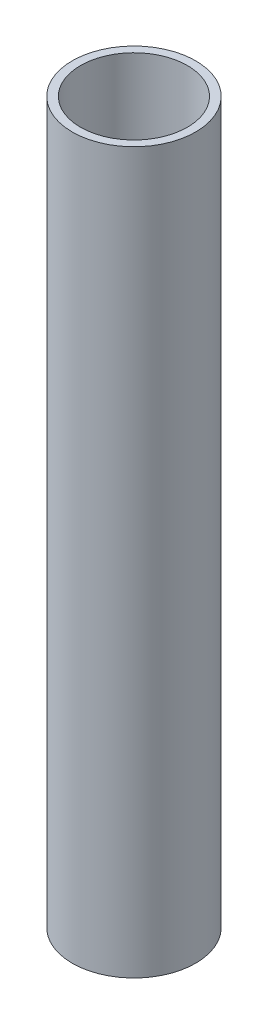
ISO-10303-21;
HEADER;
FILE_DESCRIPTION(('STEP AP214'),'2;1');
FILE_NAME('part.step','',(''),(''),'','','');
FILE_SCHEMA(('AUTOMOTIVE_DESIGN { 1 0 10303 214 1 1 1 1 }'));
ENDSEC;
DATA;
#1=APPLICATION_CONTEXT('core data for automotive mechanical design processes');
#2=APPLICATION_PROTOCOL_DEFINITION('international standard','automotive_design',2000,#1);
#3=PRODUCT_CONTEXT('',#1,'mechanical');
#4=PRODUCT('Part','Part','',(#3));
#5=PRODUCT_RELATED_PRODUCT_CATEGORY('part','',(#4));
#6=PRODUCT_DEFINITION_FORMATION('','',#4);
#7=PRODUCT_DEFINITION_CONTEXT('part definition',#1,'design');
#8=PRODUCT_DEFINITION('design','',#6,#7);
#9=PRODUCT_DEFINITION_SHAPE('','',#8);
#10=(LENGTH_UNIT() NAMED_UNIT(*) SI_UNIT(.MILLI.,.METRE.));
#11=(NAMED_UNIT(*) PLANE_ANGLE_UNIT() SI_UNIT($,.RADIAN.));
#12=(NAMED_UNIT(*) SI_UNIT($,.STERADIAN.) SOLID_ANGLE_UNIT());
#13=UNCERTAINTY_MEASURE_WITH_UNIT(LENGTH_MEASURE(1.E-05),#10,'distance_accuracy_value','');
#14=(GEOMETRIC_REPRESENTATION_CONTEXT(3) GLOBAL_UNCERTAINTY_ASSIGNED_CONTEXT((#13)) GLOBAL_UNIT_ASSIGNED_CONTEXT((#10,
#11,#12)) REPRESENTATION_CONTEXT('',''));
#15=CARTESIAN_POINT('',(0.,0.,0.));
#16=DIRECTION('',(0.,0.,1.));
#17=DIRECTION('',(1.,0.,0.));
#18=AXIS2_PLACEMENT_3D('',#15,#16,#17);
#19=CARTESIAN_POINT('',(0.,35.,0.));
#20=DIRECTION('',(0.,1.,0.));
#21=DIRECTION('',(0.,0.,1.));
#22=AXIS2_PLACEMENT_3D('',#19,#20,#21);
#23=PLANE('',#22);
#24=CARTESIAN_POINT('',(0.,35.,0.));
#25=DIRECTION('',(0.,1.,0.));
#26=DIRECTION('',(0.,0.,1.));
#27=AXIS2_PLACEMENT_3D('',#24,#25,#26);
#28=CIRCLE('',#27,3.);
#29=CARTESIAN_POINT('',(0.,35.,3.));
#30=VERTEX_POINT('',#29);
#31=EDGE_CURVE('E10',#30,#30,#28,.T.);
#32=ORIENTED_EDGE('',*,*,#31,.T.);
#33=EDGE_LOOP('',(#32));
#34=FACE_BOUND('',#33,.T.);
#35=CARTESIAN_POINT('',(0.,35.,0.));
#36=DIRECTION('',(0.,1.,0.));
#37=DIRECTION('',(0.,0.,1.));
#38=AXIS2_PLACEMENT_3D('',#35,#36,#37);
#39=CIRCLE('',#38,2.6);
#40=CARTESIAN_POINT('',(0.,35.,2.6));
#41=VERTEX_POINT('',#40);
#42=EDGE_CURVE('E46',#41,#41,#39,.T.);
#43=ORIENTED_EDGE('',*,*,#42,.F.);
#44=EDGE_LOOP('',(#43));
#45=FACE_BOUND('',#44,.T.);
#46=ADVANCED_FACE('F35',(#34,#45),#23,.T.);
#47=CARTESIAN_POINT('',(0.,0.,0.));
#48=DIRECTION('',(0.,1.,0.));
#49=DIRECTION('',(0.,0.,1.));
#50=AXIS2_PLACEMENT_3D('',#47,#48,#49);
#51=PLANE('',#50);
#52=CARTESIAN_POINT('',(0.,0.,0.));
#53=DIRECTION('',(0.,1.,0.));
#54=DIRECTION('',(0.,0.,1.));
#55=AXIS2_PLACEMENT_3D('',#52,#53,#54);
#56=CIRCLE('',#55,3.);
#57=CARTESIAN_POINT('',(0.,0.,3.));
#58=VERTEX_POINT('',#57);
#59=EDGE_CURVE('E39',#58,#58,#56,.T.);
#60=ORIENTED_EDGE('',*,*,#59,.F.);
#61=EDGE_LOOP('',(#60));
#62=FACE_BOUND('',#61,.T.);
#63=CARTESIAN_POINT('',(0.,0.,0.));
#64=DIRECTION('',(0.,1.,0.));
#65=DIRECTION('',(0.,0.,1.));
#66=AXIS2_PLACEMENT_3D('',#63,#64,#65);
#67=CIRCLE('',#66,2.6);
#68=CARTESIAN_POINT('',(0.,0.,2.6));
#69=VERTEX_POINT('',#68);
#70=EDGE_CURVE('E48',#69,#69,#67,.T.);
#71=ORIENTED_EDGE('',*,*,#70,.T.);
#72=EDGE_LOOP('',(#71));
#73=FACE_BOUND('',#72,.T.);
#74=ADVANCED_FACE('F58',(#62,#73),#51,.F.);
#75=CARTESIAN_POINT('',(0.,35.,0.));
#76=DIRECTION('',(0.,-1.,0.));
#77=DIRECTION('',(0.,0.,-1.));
#78=AXIS2_PLACEMENT_3D('',#75,#76,#77);
#79=CYLINDRICAL_SURFACE('',#78,3.);
#80=ORIENTED_EDGE('',*,*,#31,.F.);
#81=EDGE_LOOP('',(#80));
#82=FACE_BOUND('',#81,.T.);
#83=ORIENTED_EDGE('',*,*,#59,.T.);
#84=EDGE_LOOP('',(#83));
#85=FACE_BOUND('',#84,.T.);
#86=ADVANCED_FACE('F37',(#82,#85),#79,.T.);
#87=CARTESIAN_POINT('',(0.,35.,0.));
#88=DIRECTION('',(0.,-1.,0.));
#89=DIRECTION('',(0.,0.,-1.));
#90=AXIS2_PLACEMENT_3D('',#87,#88,#89);
#91=CYLINDRICAL_SURFACE('',#90,2.6);
#92=ORIENTED_EDGE('',*,*,#42,.T.);
#93=EDGE_LOOP('',(#92));
#94=FACE_BOUND('',#93,.T.);
#95=ORIENTED_EDGE('',*,*,#70,.F.);
#96=EDGE_LOOP('',(#95));
#97=FACE_BOUND('',#96,.T.);
#98=ADVANCED_FACE('F54',(#94,#97),#91,.F.);
#99=CLOSED_SHELL('',(#46,#74,#86,#98));
#100=MANIFOLD_SOLID_BREP('B2',#99);
#101=ADVANCED_BREP_SHAPE_REPRESENTATION('',(#18,#100),#14);
#102=SHAPE_DEFINITION_REPRESENTATION(#9,#101);
ENDSEC;
END-ISO-10303-21;
